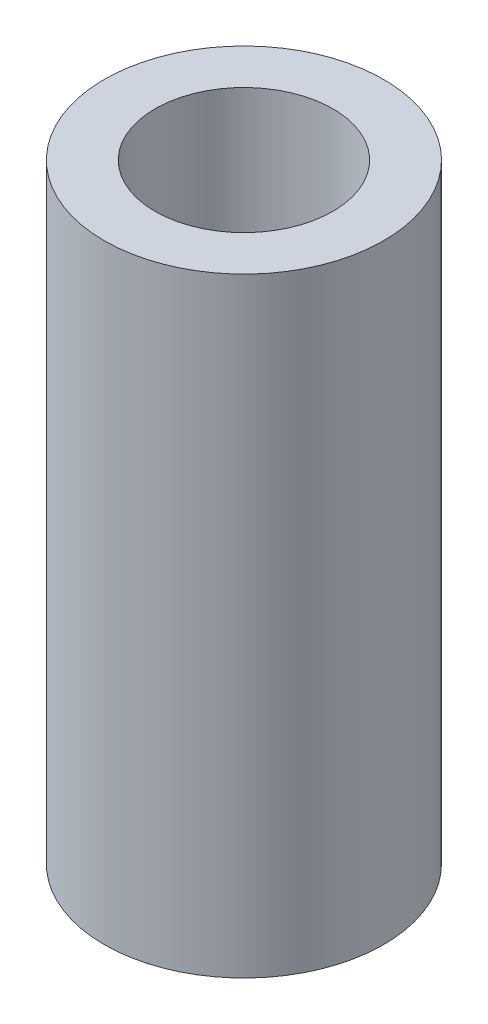
ISO-10303-21;
HEADER;
FILE_DESCRIPTION(('STEP AP214'),'2;1');
FILE_NAME('part.step','',(''),(''),'','','');
FILE_SCHEMA(('AUTOMOTIVE_DESIGN { 1 0 10303 214 1 1 1 1 }'));
ENDSEC;
DATA;
#1=APPLICATION_CONTEXT('core data for automotive mechanical design processes');
#2=APPLICATION_PROTOCOL_DEFINITION('international standard','automotive_design',2000,#1);
#3=PRODUCT_CONTEXT('',#1,'mechanical');
#4=PRODUCT('Part','Part','',(#3));
#5=PRODUCT_RELATED_PRODUCT_CATEGORY('part','',(#4));
#6=PRODUCT_DEFINITION_FORMATION('','',#4);
#7=PRODUCT_DEFINITION_CONTEXT('part definition',#1,'design');
#8=PRODUCT_DEFINITION('design','',#6,#7);
#9=PRODUCT_DEFINITION_SHAPE('','',#8);
#10=(LENGTH_UNIT() NAMED_UNIT(*) SI_UNIT(.MILLI.,.METRE.));
#11=(NAMED_UNIT(*) PLANE_ANGLE_UNIT() SI_UNIT($,.RADIAN.));
#12=(NAMED_UNIT(*) SI_UNIT($,.STERADIAN.) SOLID_ANGLE_UNIT());
#13=UNCERTAINTY_MEASURE_WITH_UNIT(LENGTH_MEASURE(1.E-05),#10,'distance_accuracy_value','');
#14=(GEOMETRIC_REPRESENTATION_CONTEXT(3) GLOBAL_UNCERTAINTY_ASSIGNED_CONTEXT((#13)) GLOBAL_UNIT_ASSIGNED_CONTEXT((#10,
#11,#12)) REPRESENTATION_CONTEXT('',''));
#15=CARTESIAN_POINT('',(0.,0.,0.));
#16=DIRECTION('',(0.,0.,1.));
#17=DIRECTION('',(1.,0.,0.));
#18=AXIS2_PLACEMENT_3D('',#15,#16,#17);
#19=CARTESIAN_POINT('',(0.,12.,0.));
#20=DIRECTION('',(0.,1.,0.));
#21=DIRECTION('',(0.,0.,1.));
#22=AXIS2_PLACEMENT_3D('',#19,#20,#21);
#23=PLANE('',#22);
#24=CARTESIAN_POINT('',(0.,12.,0.));
#25=DIRECTION('',(0.,1.,0.));
#26=DIRECTION('',(0.,0.,1.));
#27=AXIS2_PLACEMENT_3D('',#24,#25,#26);
#28=CIRCLE('',#27,2.75);
#29=CARTESIAN_POINT('',(0.,12.,2.75));
#30=VERTEX_POINT('',#29);
#31=EDGE_CURVE('E10',#30,#30,#28,.T.);
#32=ORIENTED_EDGE('',*,*,#31,.T.);
#33=EDGE_LOOP('',(#32));
#34=FACE_BOUND('',#33,.T.);
#35=CARTESIAN_POINT('',(0.,12.,0.));
#36=DIRECTION('',(0.,1.,0.));
#37=DIRECTION('',(0.,0.,1.));
#38=AXIS2_PLACEMENT_3D('',#35,#36,#37);
#39=CIRCLE('',#38,1.75);
#40=CARTESIAN_POINT('',(0.,12.,1.75));
#41=VERTEX_POINT('',#40);
#42=EDGE_CURVE('E42',#41,#41,#39,.T.);
#43=ORIENTED_EDGE('',*,*,#42,.F.);
#44=EDGE_LOOP('',(#43));
#45=FACE_BOUND('',#44,.T.);
#46=ADVANCED_FACE('F31',(#34,#45),#23,.T.);
#47=CARTESIAN_POINT('',(0.,0.,0.));
#48=DIRECTION('',(0.,1.,0.));
#49=DIRECTION('',(0.,0.,1.));
#50=AXIS2_PLACEMENT_3D('',#47,#48,#49);
#51=PLANE('',#50);
#52=CARTESIAN_POINT('',(0.,0.,0.));
#53=DIRECTION('',(0.,1.,0.));
#54=DIRECTION('',(0.,0.,1.));
#55=AXIS2_PLACEMENT_3D('',#52,#53,#54);
#56=CIRCLE('',#55,2.75);
#57=CARTESIAN_POINT('',(0.,0.,2.75));
#58=VERTEX_POINT('',#57);
#59=EDGE_CURVE('E35',#58,#58,#56,.T.);
#60=ORIENTED_EDGE('',*,*,#59,.F.);
#61=EDGE_LOOP('',(#60));
#62=FACE_BOUND('',#61,.T.);
#63=CARTESIAN_POINT('',(0.,0.,0.));
#64=DIRECTION('',(0.,1.,0.));
#65=DIRECTION('',(0.,0.,1.));
#66=AXIS2_PLACEMENT_3D('',#63,#64,#65);
#67=CIRCLE('',#66,1.75);
#68=CARTESIAN_POINT('',(0.,0.,1.75));
#69=VERTEX_POINT('',#68);
#70=EDGE_CURVE('E44',#69,#69,#67,.T.);
#71=ORIENTED_EDGE('',*,*,#70,.T.);
#72=EDGE_LOOP('',(#71));
#73=FACE_BOUND('',#72,.T.);
#74=ADVANCED_FACE('F54',(#62,#73),#51,.F.);
#75=CARTESIAN_POINT('',(0.,12.,0.));
#76=DIRECTION('',(0.,-1.,0.));
#77=DIRECTION('',(0.,0.,-1.));
#78=AXIS2_PLACEMENT_3D('',#75,#76,#77);
#79=CYLINDRICAL_SURFACE('',#78,2.75);
#80=ORIENTED_EDGE('',*,*,#31,.F.);
#81=EDGE_LOOP('',(#80));
#82=FACE_BOUND('',#81,.T.);
#83=ORIENTED_EDGE('',*,*,#59,.T.);
#84=EDGE_LOOP('',(#83));
#85=FACE_BOUND('',#84,.T.);
#86=ADVANCED_FACE('F33',(#82,#85),#79,.T.);
#87=CARTESIAN_POINT('',(0.,12.,0.));
#88=DIRECTION('',(0.,-1.,0.));
#89=DIRECTION('',(0.,0.,-1.));
#90=AXIS2_PLACEMENT_3D('',#87,#88,#89);
#91=CYLINDRICAL_SURFACE('',#90,1.75);
#92=ORIENTED_EDGE('',*,*,#42,.T.);
#93=EDGE_LOOP('',(#92));
#94=FACE_BOUND('',#93,.T.);
#95=ORIENTED_EDGE('',*,*,#70,.F.);
#96=EDGE_LOOP('',(#95));
#97=FACE_BOUND('',#96,.T.);
#98=ADVANCED_FACE('F50',(#94,#97),#91,.F.);
#99=CLOSED_SHELL('',(#46,#74,#86,#98));
#100=MANIFOLD_SOLID_BREP('B2',#99);
#101=ADVANCED_BREP_SHAPE_REPRESENTATION('',(#18,#100),#14);
#102=SHAPE_DEFINITION_REPRESENTATION(#9,#101);
ENDSEC;
END-ISO-10303-21;
